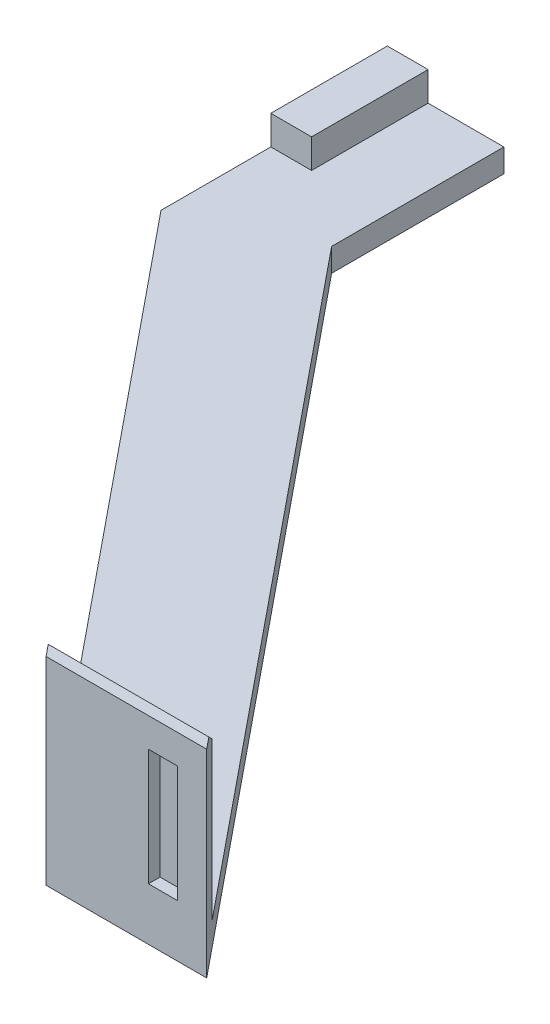
ISO-10303-21;
HEADER;
FILE_DESCRIPTION(('STEP AP214'),'2;1');
FILE_NAME('part.step','',(''),(''),'','','');
FILE_SCHEMA(('AUTOMOTIVE_DESIGN { 1 0 10303 214 1 1 1 1 }'));
ENDSEC;
DATA;
#1=APPLICATION_CONTEXT('core data for automotive mechanical design processes');
#2=APPLICATION_PROTOCOL_DEFINITION('international standard','automotive_design',2000,#1);
#3=PRODUCT_CONTEXT('',#1,'mechanical');
#4=PRODUCT('Part','Part','',(#3));
#5=PRODUCT_RELATED_PRODUCT_CATEGORY('part','',(#4));
#6=PRODUCT_DEFINITION_FORMATION('','',#4);
#7=PRODUCT_DEFINITION_CONTEXT('part definition',#1,'design');
#8=PRODUCT_DEFINITION('design','',#6,#7);
#9=PRODUCT_DEFINITION_SHAPE('','',#8);
#10=(LENGTH_UNIT() NAMED_UNIT(*) SI_UNIT(.MILLI.,.METRE.));
#11=(NAMED_UNIT(*) PLANE_ANGLE_UNIT() SI_UNIT($,.RADIAN.));
#12=(NAMED_UNIT(*) SI_UNIT($,.STERADIAN.) SOLID_ANGLE_UNIT());
#13=UNCERTAINTY_MEASURE_WITH_UNIT(LENGTH_MEASURE(1.E-05),#10,'distance_accuracy_value','');
#14=(GEOMETRIC_REPRESENTATION_CONTEXT(3) GLOBAL_UNCERTAINTY_ASSIGNED_CONTEXT((#13)) GLOBAL_UNIT_ASSIGNED_CONTEXT((#10,
#11,#12)) REPRESENTATION_CONTEXT('',''));
#15=CARTESIAN_POINT('',(0.,0.,0.));
#16=DIRECTION('',(0.,0.,1.));
#17=DIRECTION('',(1.,0.,0.));
#18=AXIS2_PLACEMENT_3D('',#15,#16,#17);
#19=CARTESIAN_POINT('',(0.,4.,0.));
#20=DIRECTION('',(0.,-1.,0.));
#21=DIRECTION('',(0.,0.,-1.));
#22=AXIS2_PLACEMENT_3D('',#19,#20,#21);
#23=PLANE('',#22);
#24=DIRECTION('',(1.,0.,0.));
#25=VECTOR('',#24,1.);
#26=CARTESIAN_POINT('',(82.3748336188116,4.,-5.));
#27=LINE('',#26,#25);
#28=CARTESIAN_POINT('',(82.3748336188116,4.,-5.));
#29=VERTEX_POINT('',#28);
#30=CARTESIAN_POINT('',(109.928571428571,4.,-5.));
#31=VERTEX_POINT('',#30);
#32=EDGE_CURVE('E228',#29,#31,#27,.T.);
#33=ORIENTED_EDGE('',*,*,#32,.T.);
#34=DIRECTION('',(0.631426343209567,0.,0.775435860081925));
#35=VECTOR('',#34,1.);
#36=CARTESIAN_POINT('',(114.,4.,0.));
#37=LINE('',#36,#35);
#38=CARTESIAN_POINT('',(20.,4.,-115.438596491228));
#39=VERTEX_POINT('',#38);
#40=EDGE_CURVE('E218',#39,#31,#37,.T.);
#41=ORIENTED_EDGE('',*,*,#40,.F.);
#42=DIRECTION('',(0.,0.,1.));
#43=VECTOR('',#42,1.);
#44=CARTESIAN_POINT('',(20.,4.,-145.));
#45=LINE('',#44,#43);
#46=CARTESIAN_POINT('',(20.,4.,-145.));
#47=VERTEX_POINT('',#46);
#48=EDGE_CURVE('E280',#47,#39,#45,.T.);
#49=ORIENTED_EDGE('',*,*,#48,.F.);
#50=DIRECTION('',(1.,0.,0.));
#51=VECTOR('',#50,1.);
#52=CARTESIAN_POINT('',(20.,4.,-145.));
#53=LINE('',#52,#51);
#54=CARTESIAN_POINT('',(7.,4.,-145.));
#55=VERTEX_POINT('',#54);
#56=EDGE_CURVE('E273',#55,#47,#53,.T.);
#57=ORIENTED_EDGE('',*,*,#56,.F.);
#58=DIRECTION('',(0.,0.,1.));
#59=VECTOR('',#58,1.);
#60=CARTESIAN_POINT('',(7.,4.,-145.));
#61=LINE('',#60,#59);
#62=CARTESIAN_POINT('',(7.,4.,-125.));
#63=VERTEX_POINT('',#62);
#64=EDGE_CURVE('E171',#55,#63,#61,.T.);
#65=ORIENTED_EDGE('',*,*,#64,.T.);
#66=DIRECTION('',(-1.,0.,0.));
#67=VECTOR('',#66,1.);
#68=CARTESIAN_POINT('',(0.,4.,-125.));
#69=LINE('',#68,#67);
#70=CARTESIAN_POINT('',(0.,4.,-125.));
#71=VERTEX_POINT('',#70);
#72=EDGE_CURVE('E174',#63,#71,#69,.T.);
#73=ORIENTED_EDGE('',*,*,#72,.T.);
#74=DIRECTION('',(0.,0.,-1.));
#75=VECTOR('',#74,1.);
#76=CARTESIAN_POINT('',(0.,4.,-140.));
#77=LINE('',#76,#75);
#78=CARTESIAN_POINT('',(0.,4.,-106.160035841102));
#79=VERTEX_POINT('',#78);
#80=EDGE_CURVE('E269',#79,#71,#77,.T.);
#81=ORIENTED_EDGE('',*,*,#80,.F.);
#82=DIRECTION('',(-0.631434001711775,0.,-0.775429623810088));
#83=VECTOR('',#82,1.);
#84=CARTESIAN_POINT('',(86.4463443163861,4.,0.));
#85=LINE('',#84,#83);
#86=EDGE_CURVE('E274',#29,#79,#85,.T.);
#87=ORIENTED_EDGE('',*,*,#86,.F.);
#88=EDGE_LOOP('',(#33,#41,#49,#57,#65,#73,#81,#87));
#89=FACE_BOUND('',#88,.T.);
#90=ADVANCED_FACE('F35',(#89),#23,.F.);
#91=CARTESIAN_POINT('',(109.,34.,0.));
#92=DIRECTION('',(1.,0.,0.));
#93=DIRECTION('',(0.,0.,1.));
#94=AXIS2_PLACEMENT_3D('',#91,#92,#93);
#95=PLANE('',#94);
#96=DIRECTION('',(0.,-1.,0.));
#97=VECTOR('',#96,1.);
#98=CARTESIAN_POINT('',(109.,34.,-2.));
#99=LINE('',#98,#97);
#100=CARTESIAN_POINT('',(109.,29.,-2.));
#101=VERTEX_POINT('',#100);
#102=CARTESIAN_POINT('',(109.,9.,-2.));
#103=VERTEX_POINT('',#102);
#104=EDGE_CURVE('E166',#101,#103,#99,.T.);
#105=ORIENTED_EDGE('',*,*,#104,.T.);
#106=DIRECTION('',(0.,0.,-1.));
#107=VECTOR('',#106,1.);
#108=CARTESIAN_POINT('',(109.,9.,7.07106781186549));
#109=LINE('',#108,#107);
#110=CARTESIAN_POINT('',(109.,9.,0.));
#111=VERTEX_POINT('',#110);
#112=EDGE_CURVE('E148',#111,#103,#109,.T.);
#113=ORIENTED_EDGE('',*,*,#112,.F.);
#114=DIRECTION('',(0.,-1.,0.));
#115=VECTOR('',#114,1.);
#116=CARTESIAN_POINT('',(109.,34.,0.));
#117=LINE('',#116,#115);
#118=CARTESIAN_POINT('',(109.,29.,0.));
#119=VERTEX_POINT('',#118);
#120=EDGE_CURVE('E163',#119,#111,#117,.T.);
#121=ORIENTED_EDGE('',*,*,#120,.F.);
#122=DIRECTION('',(0.,0.,-1.));
#123=VECTOR('',#122,1.);
#124=CARTESIAN_POINT('',(109.,29.,0.));
#125=LINE('',#124,#123);
#126=EDGE_CURVE('E245',#119,#101,#125,.T.);
#127=ORIENTED_EDGE('',*,*,#126,.T.);
#128=EDGE_LOOP('',(#105,#113,#121,#127));
#129=FACE_BOUND('',#128,.T.);
#130=ADVANCED_FACE('F161',(#129),#95,.F.);
#131=CARTESIAN_POINT('',(109.,34.,-2.));
#132=DIRECTION('',(0.,0.,-1.));
#133=DIRECTION('',(1.,0.,0.));
#134=AXIS2_PLACEMENT_3D('',#131,#132,#133);
#135=PLANE('',#134);
#136=DIRECTION('',(-1.,0.,0.));
#137=VECTOR('',#136,1.);
#138=CARTESIAN_POINT('',(104.,29.,-2.));
#139=LINE('',#138,#137);
#140=CARTESIAN_POINT('',(104.,29.,-2.));
#141=VERTEX_POINT('',#140);
#142=EDGE_CURVE('E156',#101,#141,#139,.T.);
#143=ORIENTED_EDGE('',*,*,#142,.T.);
#144=DIRECTION('',(0.,-1.,0.));
#145=VECTOR('',#144,1.);
#146=CARTESIAN_POINT('',(104.,34.,-2.));
#147=LINE('',#146,#145);
#148=CARTESIAN_POINT('',(104.,9.,-2.));
#149=VERTEX_POINT('',#148);
#150=EDGE_CURVE('E176',#141,#149,#147,.T.);
#151=ORIENTED_EDGE('',*,*,#150,.T.);
#152=DIRECTION('',(1.,0.,0.));
#153=VECTOR('',#152,1.);
#154=CARTESIAN_POINT('',(109.,9.,-2.));
#155=LINE('',#154,#153);
#156=EDGE_CURVE('E235',#149,#103,#155,.T.);
#157=ORIENTED_EDGE('',*,*,#156,.T.);
#158=ORIENTED_EDGE('',*,*,#104,.F.);
#159=EDGE_LOOP('',(#143,#151,#157,#158));
#160=FACE_BOUND('',#159,.T.);
#161=ADVANCED_FACE('F234',(#160),#135,.F.);
#162=CARTESIAN_POINT('',(104.,34.,-2.));
#163=DIRECTION('',(-1.,0.,0.));
#164=DIRECTION('',(0.,0.,-1.));
#165=AXIS2_PLACEMENT_3D('',#162,#163,#164);
#166=PLANE('',#165);
#167=DIRECTION('',(0.,-1.,0.));
#168=VECTOR('',#167,1.);
#169=CARTESIAN_POINT('',(104.,34.,0.));
#170=LINE('',#169,#168);
#171=CARTESIAN_POINT('',(104.,29.,0.));
#172=VERTEX_POINT('',#171);
#173=CARTESIAN_POINT('',(104.,9.,0.));
#174=VERTEX_POINT('',#173);
#175=EDGE_CURVE('E223',#172,#174,#170,.T.);
#176=ORIENTED_EDGE('',*,*,#175,.T.);
#177=DIRECTION('',(0.,0.,-1.));
#178=VECTOR('',#177,1.);
#179=CARTESIAN_POINT('',(104.,9.,7.07106781186549));
#180=LINE('',#179,#178);
#181=EDGE_CURVE('E151',#174,#149,#180,.T.);
#182=ORIENTED_EDGE('',*,*,#181,.T.);
#183=ORIENTED_EDGE('',*,*,#150,.F.);
#184=DIRECTION('',(0.,0.,-1.));
#185=VECTOR('',#184,1.);
#186=CARTESIAN_POINT('',(104.,29.,0.));
#187=LINE('',#186,#185);
#188=EDGE_CURVE('E239',#172,#141,#187,.T.);
#189=ORIENTED_EDGE('',*,*,#188,.F.);
#190=EDGE_LOOP('',(#176,#182,#183,#189));
#191=FACE_BOUND('',#190,.T.);
#192=ADVANCED_FACE('F238',(#191),#166,.F.);
#193=CARTESIAN_POINT('',(114.,4.,0.));
#194=DIRECTION('',(-0.775435860081925,0.,0.631426343209567));
#195=DIRECTION('',(-0.631426343209567,0.,-0.775435860081925));
#196=AXIS2_PLACEMENT_3D('',#193,#194,#195);
#197=PLANE('',#196);
#198=DIRECTION('',(0.631426343209566,0.,0.775435860081925));
#199=VECTOR('',#198,1.);
#200=CARTESIAN_POINT('',(109.928571428571,34.,-5.));
#201=LINE('',#200,#199);
#202=CARTESIAN_POINT('',(112.371428571429,34.,-1.99999999999995));
#203=VERTEX_POINT('',#202);
#204=CARTESIAN_POINT('',(114.,34.,0.));
#205=VERTEX_POINT('',#204);
#206=EDGE_CURVE('E221',#203,#205,#201,.T.);
#207=ORIENTED_EDGE('',*,*,#206,.T.);
#208=DIRECTION('',(0.,-1.,0.));
#209=VECTOR('',#208,1.);
#210=CARTESIAN_POINT('',(114.,4.,0.));
#211=LINE('',#210,#209);
#212=CARTESIAN_POINT('',(114.,0.,0.));
#213=VERTEX_POINT('',#212);
#214=EDGE_CURVE('E208',#205,#213,#211,.T.);
#215=ORIENTED_EDGE('',*,*,#214,.T.);
#216=DIRECTION('',(0.631426343209567,0.,0.775435860081925));
#217=VECTOR('',#216,1.);
#218=CARTESIAN_POINT('',(114.,0.,0.));
#219=LINE('',#218,#217);
#220=CARTESIAN_POINT('',(20.,0.,-115.438596491228));
#221=VERTEX_POINT('',#220);
#222=EDGE_CURVE('E263',#221,#213,#219,.T.);
#223=ORIENTED_EDGE('',*,*,#222,.F.);
#224=DIRECTION('',(0.,-1.,0.));
#225=VECTOR('',#224,1.);
#226=CARTESIAN_POINT('',(20.,4.,-115.438596491228));
#227=LINE('',#226,#225);
#228=EDGE_CURVE('E283',#39,#221,#227,.T.);
#229=ORIENTED_EDGE('',*,*,#228,.F.);
#230=ORIENTED_EDGE('',*,*,#40,.T.);
#231=DIRECTION('',(0.,-1.,0.));
#232=VECTOR('',#231,1.);
#233=CARTESIAN_POINT('',(109.928571428571,34.,-5.));
#234=LINE('',#233,#232);
#235=CARTESIAN_POINT('',(109.928571428571,30.9999999999999,-5.));
#236=VERTEX_POINT('',#235);
#237=EDGE_CURVE('E215',#236,#31,#234,.T.);
#238=ORIENTED_EDGE('',*,*,#237,.F.);
#239=DIRECTION('',(-0.498983563377396,-0.612786832217861,-0.612786832217856));
#240=VECTOR('',#239,1.);
#241=CARTESIAN_POINT('',(84.3926737681051,-0.359874319871327,-36.359874319871));
#242=LINE('',#241,#240);
#243=EDGE_CURVE('E207',#203,#236,#242,.T.);
#244=ORIENTED_EDGE('',*,*,#243,.F.);
#245=EDGE_LOOP('',(#207,#215,#223,#229,#230,#238,#244));
#246=FACE_BOUND('',#245,.T.);
#247=ADVANCED_FACE('F216',(#246),#197,.F.);
#248=CARTESIAN_POINT('',(114.,4.,0.));
#249=DIRECTION('',(0.,0.,-1.));
#250=DIRECTION('',(1.,0.,0.));
#251=AXIS2_PLACEMENT_3D('',#248,#249,#250);
#252=PLANE('',#251);
#253=DIRECTION('',(-1.,0.,0.));
#254=VECTOR('',#253,1.);
#255=CARTESIAN_POINT('',(104.,9.,0.));
#256=LINE('',#255,#254);
#257=EDGE_CURVE('E145',#111,#174,#256,.T.);
#258=ORIENTED_EDGE('',*,*,#257,.T.);
#259=ORIENTED_EDGE('',*,*,#175,.F.);
#260=DIRECTION('',(-1.,0.,0.));
#261=VECTOR('',#260,1.);
#262=CARTESIAN_POINT('',(104.,29.,0.));
#263=LINE('',#262,#261);
#264=EDGE_CURVE('E170',#119,#172,#263,.T.);
#265=ORIENTED_EDGE('',*,*,#264,.F.);
#266=ORIENTED_EDGE('',*,*,#120,.T.);
#267=EDGE_LOOP('',(#258,#259,#265,#266));
#268=FACE_BOUND('',#267,.T.);
#269=DIRECTION('',(-1.,0.,0.));
#270=VECTOR('',#269,1.);
#271=CARTESIAN_POINT('',(114.,0.,0.));
#272=LINE('',#271,#270);
#273=CARTESIAN_POINT('',(86.4463443163861,0.,0.));
#274=VERTEX_POINT('',#273);
#275=EDGE_CURVE('E285',#213,#274,#272,.T.);
#276=ORIENTED_EDGE('',*,*,#275,.F.);
#277=ORIENTED_EDGE('',*,*,#214,.F.);
#278=DIRECTION('',(-1.,0.,0.));
#279=VECTOR('',#278,1.);
#280=CARTESIAN_POINT('',(109.,34.,0.));
#281=LINE('',#280,#279);
#282=CARTESIAN_POINT('',(86.4463443163861,34.,0.));
#283=VERTEX_POINT('',#282);
#284=EDGE_CURVE('E248',#205,#283,#281,.T.);
#285=ORIENTED_EDGE('',*,*,#284,.T.);
#286=DIRECTION('',(0.,-1.,0.));
#287=VECTOR('',#286,1.);
#288=CARTESIAN_POINT('',(86.4463443163861,4.,0.));
#289=LINE('',#288,#287);
#290=EDGE_CURVE('E256',#283,#274,#289,.T.);
#291=ORIENTED_EDGE('',*,*,#290,.T.);
#292=EDGE_LOOP('',(#276,#277,#285,#291));
#293=FACE_BOUND('',#292,.T.);
#294=ADVANCED_FACE('F168',(#268,#293),#252,.F.);
#295=CARTESIAN_POINT('',(86.4463443163861,4.,0.));
#296=DIRECTION('',(0.775429623810088,0.,-0.631434001711775));
#297=DIRECTION('',(0.631434001711775,0.,0.775429623810088));
#298=AXIS2_PLACEMENT_3D('',#295,#296,#297);
#299=PLANE('',#298);
#300=DIRECTION('',(0.,-1.,0.));
#301=VECTOR('',#300,1.);
#302=CARTESIAN_POINT('',(82.3748336188116,34.,-5.));
#303=LINE('',#302,#301);
#304=CARTESIAN_POINT('',(82.3748336188116,30.9999999999999,-5.));
#305=VERTEX_POINT('',#304);
#306=EDGE_CURVE('E220',#305,#29,#303,.T.);
#307=ORIENTED_EDGE('',*,*,#306,.T.);
#308=ORIENTED_EDGE('',*,*,#86,.T.);
#309=DIRECTION('',(0.,-1.,0.));
#310=VECTOR('',#309,1.);
#311=CARTESIAN_POINT('',(0.,4.,-106.160035841102));
#312=LINE('',#311,#310);
#313=CARTESIAN_POINT('',(0.,0.,-106.160035841102));
#314=VERTEX_POINT('',#313);
#315=EDGE_CURVE('E265',#79,#314,#312,.T.);
#316=ORIENTED_EDGE('',*,*,#315,.T.);
#317=DIRECTION('',(-0.631434001711775,0.,-0.775429623810088));
#318=VECTOR('',#317,1.);
#319=CARTESIAN_POINT('',(86.4463443163861,0.,0.));
#320=LINE('',#319,#318);
#321=EDGE_CURVE('E289',#274,#314,#320,.T.);
#322=ORIENTED_EDGE('',*,*,#321,.F.);
#323=ORIENTED_EDGE('',*,*,#290,.F.);
#324=DIRECTION('',(-0.631434001711776,0.,-0.775429623810087));
#325=VECTOR('',#324,1.);
#326=CARTESIAN_POINT('',(86.4463443163861,34.,0.));
#327=LINE('',#326,#325);
#328=CARTESIAN_POINT('',(84.8177400373563,34.,-1.99999999999999));
#329=VERTEX_POINT('',#328);
#330=EDGE_CURVE('E225',#283,#329,#327,.T.);
#331=ORIENTED_EDGE('',*,*,#330,.T.);
#332=DIRECTION('',(0.498991122413766,0.612783754579157,0.612783754579151));
#333=VECTOR('',#332,1.);
#334=CARTESIAN_POINT('',(63.6987894144777,8.06496974764141,-27.9350302523583));
#335=LINE('',#334,#333);
#336=EDGE_CURVE('E11',#305,#329,#335,.T.);
#337=ORIENTED_EDGE('',*,*,#336,.F.);
#338=EDGE_LOOP('',(#307,#308,#316,#322,#323,#331,#337));
#339=FACE_BOUND('',#338,.T.);
#340=ADVANCED_FACE('F254',(#339),#299,.F.);
#341=CARTESIAN_POINT('',(0.,4.,-145.));
#342=DIRECTION('',(1.,0.,0.));
#343=DIRECTION('',(0.,0.,1.));
#344=AXIS2_PLACEMENT_3D('',#341,#342,#343);
#345=PLANE('',#344);
#346=DIRECTION('',(0.,0.,-1.));
#347=VECTOR('',#346,1.);
#348=CARTESIAN_POINT('',(0.,0.,-145.));
#349=LINE('',#348,#347);
#350=CARTESIAN_POINT('',(0.,0.,-145.));
#351=VERTEX_POINT('',#350);
#352=EDGE_CURVE('E292',#314,#351,#349,.T.);
#353=ORIENTED_EDGE('',*,*,#352,.F.);
#354=ORIENTED_EDGE('',*,*,#315,.F.);
#355=ORIENTED_EDGE('',*,*,#80,.T.);
#356=DIRECTION('',(0.,-1.,0.));
#357=VECTOR('',#356,1.);
#358=CARTESIAN_POINT('',(0.,9.,-125.));
#359=LINE('',#358,#357);
#360=CARTESIAN_POINT('',(0.,9.,-125.));
#361=VERTEX_POINT('',#360);
#362=EDGE_CURVE('E191',#361,#71,#359,.T.);
#363=ORIENTED_EDGE('',*,*,#362,.F.);
#364=DIRECTION('',(0.,0.,-1.));
#365=VECTOR('',#364,1.);
#366=CARTESIAN_POINT('',(0.,9.,-145.));
#367=LINE('',#366,#365);
#368=CARTESIAN_POINT('',(0.,9.,-145.));
#369=VERTEX_POINT('',#368);
#370=EDGE_CURVE('E180',#361,#369,#367,.T.);
#371=ORIENTED_EDGE('',*,*,#370,.T.);
#372=DIRECTION('',(0.,-1.,0.));
#373=VECTOR('',#372,1.);
#374=CARTESIAN_POINT('',(0.,4.,-145.));
#375=LINE('',#374,#373);
#376=EDGE_CURVE('E305',#369,#351,#375,.T.);
#377=ORIENTED_EDGE('',*,*,#376,.T.);
#378=EDGE_LOOP('',(#353,#354,#355,#363,#371,#377));
#379=FACE_BOUND('',#378,.T.);
#380=ADVANCED_FACE('F312',(#379),#345,.F.);
#381=CARTESIAN_POINT('',(20.,4.,-145.));
#382=DIRECTION('',(0.,0.,1.));
#383=DIRECTION('',(-1.,0.,0.));
#384=AXIS2_PLACEMENT_3D('',#381,#382,#383);
#385=PLANE('',#384);
#386=DIRECTION('',(1.,0.,0.));
#387=VECTOR('',#386,1.);
#388=CARTESIAN_POINT('',(20.,0.,-145.));
#389=LINE('',#388,#387);
#390=CARTESIAN_POINT('',(20.,0.,-145.));
#391=VERTEX_POINT('',#390);
#392=EDGE_CURVE('E295',#351,#391,#389,.T.);
#393=ORIENTED_EDGE('',*,*,#392,.F.);
#394=ORIENTED_EDGE('',*,*,#376,.F.);
#395=DIRECTION('',(1.,0.,0.));
#396=VECTOR('',#395,1.);
#397=CARTESIAN_POINT('',(0.,9.,-145.));
#398=LINE('',#397,#396);
#399=CARTESIAN_POINT('',(7.,9.,-145.));
#400=VERTEX_POINT('',#399);
#401=EDGE_CURVE('E183',#369,#400,#398,.T.);
#402=ORIENTED_EDGE('',*,*,#401,.T.);
#403=DIRECTION('',(0.,-1.,0.));
#404=VECTOR('',#403,1.);
#405=CARTESIAN_POINT('',(7.,9.,-145.));
#406=LINE('',#405,#404);
#407=EDGE_CURVE('E286',#400,#55,#406,.T.);
#408=ORIENTED_EDGE('',*,*,#407,.T.);
#409=ORIENTED_EDGE('',*,*,#56,.T.);
#410=DIRECTION('',(0.,-1.,0.));
#411=VECTOR('',#410,1.);
#412=CARTESIAN_POINT('',(20.,4.,-145.));
#413=LINE('',#412,#411);
#414=EDGE_CURVE('E302',#47,#391,#413,.T.);
#415=ORIENTED_EDGE('',*,*,#414,.T.);
#416=EDGE_LOOP('',(#393,#394,#402,#408,#409,#415));
#417=FACE_BOUND('',#416,.T.);
#418=ADVANCED_FACE('F343',(#417),#385,.F.);
#419=CARTESIAN_POINT('',(20.,4.,-145.));
#420=DIRECTION('',(-1.,0.,0.));
#421=DIRECTION('',(0.,0.,-1.));
#422=AXIS2_PLACEMENT_3D('',#419,#420,#421);
#423=PLANE('',#422);
#424=DIRECTION('',(0.,0.,1.));
#425=VECTOR('',#424,1.);
#426=CARTESIAN_POINT('',(20.,0.,-145.));
#427=LINE('',#426,#425);
#428=EDGE_CURVE('E298',#391,#221,#427,.T.);
#429=ORIENTED_EDGE('',*,*,#428,.F.);
#430=ORIENTED_EDGE('',*,*,#414,.F.);
#431=ORIENTED_EDGE('',*,*,#48,.T.);
#432=ORIENTED_EDGE('',*,*,#228,.T.);
#433=EDGE_LOOP('',(#429,#430,#431,#432));
#434=FACE_BOUND('',#433,.T.);
#435=ADVANCED_FACE('F340',(#434),#423,.F.);
#436=CARTESIAN_POINT('',(0.,0.,0.));
#437=DIRECTION('',(0.,-1.,0.));
#438=DIRECTION('',(0.,0.,-1.));
#439=AXIS2_PLACEMENT_3D('',#436,#437,#438);
#440=PLANE('',#439);
#441=ORIENTED_EDGE('',*,*,#222,.T.);
#442=ORIENTED_EDGE('',*,*,#275,.T.);
#443=ORIENTED_EDGE('',*,*,#321,.T.);
#444=ORIENTED_EDGE('',*,*,#352,.T.);
#445=ORIENTED_EDGE('',*,*,#392,.T.);
#446=ORIENTED_EDGE('',*,*,#428,.T.);
#447=EDGE_LOOP('',(#441,#442,#443,#444,#445,#446));
#448=FACE_BOUND('',#447,.T.);
#449=ADVANCED_FACE('F316',(#448),#440,.T.);
#450=CARTESIAN_POINT('',(7.,9.,-145.));
#451=DIRECTION('',(-1.,0.,0.));
#452=DIRECTION('',(0.,0.,-1.));
#453=AXIS2_PLACEMENT_3D('',#450,#451,#452);
#454=PLANE('',#453);
#455=ORIENTED_EDGE('',*,*,#64,.F.);
#456=ORIENTED_EDGE('',*,*,#407,.F.);
#457=DIRECTION('',(0.,0.,1.));
#458=VECTOR('',#457,1.);
#459=CARTESIAN_POINT('',(7.,9.,-145.));
#460=LINE('',#459,#458);
#461=CARTESIAN_POINT('',(7.,9.,-125.));
#462=VERTEX_POINT('',#461);
#463=EDGE_CURVE('E186',#400,#462,#460,.T.);
#464=ORIENTED_EDGE('',*,*,#463,.T.);
#465=DIRECTION('',(0.,-1.,0.));
#466=VECTOR('',#465,1.);
#467=CARTESIAN_POINT('',(7.,9.,-125.));
#468=LINE('',#467,#466);
#469=EDGE_CURVE('E194',#462,#63,#468,.T.);
#470=ORIENTED_EDGE('',*,*,#469,.T.);
#471=EDGE_LOOP('',(#455,#456,#464,#470));
#472=FACE_BOUND('',#471,.T.);
#473=ADVANCED_FACE('F336',(#472),#454,.F.);
#474=CARTESIAN_POINT('',(0.,9.,-125.));
#475=DIRECTION('',(0.,0.,-1.));
#476=DIRECTION('',(1.,0.,0.));
#477=AXIS2_PLACEMENT_3D('',#474,#475,#476);
#478=PLANE('',#477);
#479=ORIENTED_EDGE('',*,*,#72,.F.);
#480=ORIENTED_EDGE('',*,*,#469,.F.);
#481=DIRECTION('',(-1.,0.,0.));
#482=VECTOR('',#481,1.);
#483=CARTESIAN_POINT('',(0.,9.,-125.));
#484=LINE('',#483,#482);
#485=EDGE_CURVE('E189',#462,#361,#484,.T.);
#486=ORIENTED_EDGE('',*,*,#485,.T.);
#487=ORIENTED_EDGE('',*,*,#362,.T.);
#488=EDGE_LOOP('',(#479,#480,#486,#487));
#489=FACE_BOUND('',#488,.T.);
#490=ADVANCED_FACE('F371',(#489),#478,.F.);
#491=CARTESIAN_POINT('',(0.,9.,0.));
#492=DIRECTION('',(0.,-1.,0.));
#493=DIRECTION('',(0.,0.,-1.));
#494=AXIS2_PLACEMENT_3D('',#491,#492,#493);
#495=PLANE('',#494);
#496=ORIENTED_EDGE('',*,*,#370,.F.);
#497=ORIENTED_EDGE('',*,*,#485,.F.);
#498=ORIENTED_EDGE('',*,*,#463,.F.);
#499=ORIENTED_EDGE('',*,*,#401,.F.);
#500=EDGE_LOOP('',(#496,#497,#498,#499));
#501=FACE_BOUND('',#500,.T.);
#502=ADVANCED_FACE('F378',(#501),#495,.F.);
#503=CARTESIAN_POINT('',(82.3748336188116,34.,-5.));
#504=DIRECTION('',(0.,0.,1.));
#505=DIRECTION('',(-1.,0.,0.));
#506=AXIS2_PLACEMENT_3D('',#503,#504,#505);
#507=PLANE('',#506);
#508=ORIENTED_EDGE('',*,*,#237,.T.);
#509=ORIENTED_EDGE('',*,*,#32,.F.);
#510=ORIENTED_EDGE('',*,*,#306,.F.);
#511=DIRECTION('',(-1.,0.,0.));
#512=VECTOR('',#511,1.);
#513=CARTESIAN_POINT('',(82.3748336188116,30.9999999999999,-5.));
#514=LINE('',#513,#512);
#515=EDGE_CURVE('E43',#236,#305,#514,.T.);
#516=ORIENTED_EDGE('',*,*,#515,.F.);
#517=EDGE_LOOP('',(#508,#509,#510,#516));
#518=FACE_BOUND('',#517,.T.);
#519=ADVANCED_FACE('F385',(#518),#507,.F.);
#520=CARTESIAN_POINT('',(0.,34.,0.));
#521=DIRECTION('',(0.,1.,0.));
#522=DIRECTION('',(0.,0.,1.));
#523=AXIS2_PLACEMENT_3D('',#520,#521,#522);
#524=PLANE('',#523);
#525=ORIENTED_EDGE('',*,*,#330,.F.);
#526=ORIENTED_EDGE('',*,*,#284,.F.);
#527=ORIENTED_EDGE('',*,*,#206,.F.);
#528=DIRECTION('',(1.,0.,0.));
#529=VECTOR('',#528,1.);
#530=CARTESIAN_POINT('',(109.928571428571,34.,-1.99999999999997));
#531=LINE('',#530,#529);
#532=EDGE_CURVE('E205',#329,#203,#531,.T.);
#533=ORIENTED_EDGE('',*,*,#532,.F.);
#534=EDGE_LOOP('',(#525,#526,#527,#533));
#535=FACE_BOUND('',#534,.T.);
#536=ADVANCED_FACE('F258',(#535),#524,.T.);
#537=CARTESIAN_POINT('',(104.,29.,0.));
#538=DIRECTION('',(0.,1.,0.));
#539=DIRECTION('',(0.,0.,1.));
#540=AXIS2_PLACEMENT_3D('',#537,#538,#539);
#541=PLANE('',#540);
#542=ORIENTED_EDGE('',*,*,#142,.F.);
#543=ORIENTED_EDGE('',*,*,#126,.F.);
#544=ORIENTED_EDGE('',*,*,#264,.T.);
#545=ORIENTED_EDGE('',*,*,#188,.T.);
#546=EDGE_LOOP('',(#542,#543,#544,#545));
#547=FACE_BOUND('',#546,.T.);
#548=ADVANCED_FACE('F393',(#547),#541,.F.);
#549=CARTESIAN_POINT('',(0.,34.,-1.99999999999998));
#550=DIRECTION('',(0.,0.707106781186544,-0.707106781186551));
#551=DIRECTION('',(-1.,0.,0.));
#552=AXIS2_PLACEMENT_3D('',#549,#550,#551);
#553=PLANE('',#552);
#554=ORIENTED_EDGE('',*,*,#336,.T.);
#555=ORIENTED_EDGE('',*,*,#532,.T.);
#556=ORIENTED_EDGE('',*,*,#243,.T.);
#557=ORIENTED_EDGE('',*,*,#515,.T.);
#558=EDGE_LOOP('',(#554,#555,#556,#557));
#559=FACE_BOUND('',#558,.T.);
#560=ADVANCED_FACE('F37',(#559),#553,.T.);
#561=CARTESIAN_POINT('',(104.,9.,7.07106781186549));
#562=DIRECTION('',(0.,1.,0.));
#563=DIRECTION('',(0.,0.,1.));
#564=AXIS2_PLACEMENT_3D('',#561,#562,#563);
#565=PLANE('',#564);
#566=ORIENTED_EDGE('',*,*,#156,.F.);
#567=ORIENTED_EDGE('',*,*,#181,.F.);
#568=ORIENTED_EDGE('',*,*,#257,.F.);
#569=ORIENTED_EDGE('',*,*,#112,.T.);
#570=EDGE_LOOP('',(#566,#567,#568,#569));
#571=FACE_BOUND('',#570,.T.);
#572=ADVANCED_FACE('F147',(#571),#565,.T.);
#573=CLOSED_SHELL('',(#90,#130,#161,#192,#247,#294,#340,#380,#418,#435,#449,#473,#490,#502,#519,
#536,#548,#560,#572));
#574=MANIFOLD_SOLID_BREP('B2',#573);
#575=ADVANCED_BREP_SHAPE_REPRESENTATION('',(#18,#574),#14);
#576=SHAPE_DEFINITION_REPRESENTATION(#9,#575);
ENDSEC;
END-ISO-10303-21;
